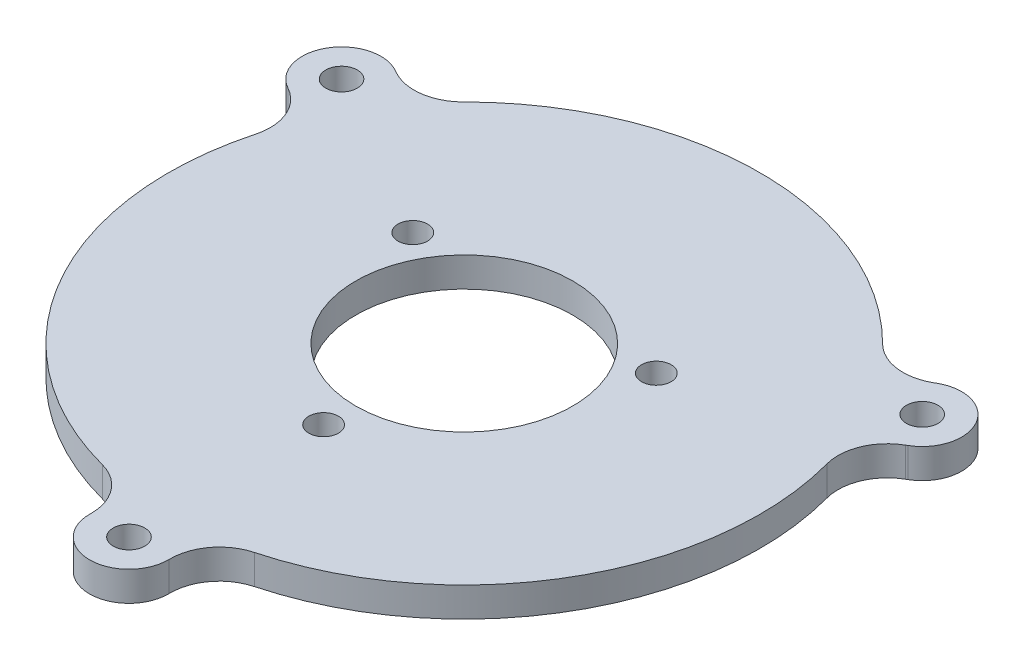
ISO-10303-21;
HEADER;
FILE_DESCRIPTION(('STEP AP214'),'2;1');
FILE_NAME('part.step','',(''),(''),'','','');
FILE_SCHEMA(('AUTOMOTIVE_DESIGN { 1 0 10303 214 1 1 1 1 }'));
ENDSEC;
DATA;
#1=APPLICATION_CONTEXT('core data for automotive mechanical design processes');
#2=APPLICATION_PROTOCOL_DEFINITION('international standard','automotive_design',2000,#1);
#3=PRODUCT_CONTEXT('',#1,'mechanical');
#4=PRODUCT('Part','Part','',(#3));
#5=PRODUCT_RELATED_PRODUCT_CATEGORY('part','',(#4));
#6=PRODUCT_DEFINITION_FORMATION('','',#4);
#7=PRODUCT_DEFINITION_CONTEXT('part definition',#1,'design');
#8=PRODUCT_DEFINITION('design','',#6,#7);
#9=PRODUCT_DEFINITION_SHAPE('','',#8);
#10=(LENGTH_UNIT() NAMED_UNIT(*) SI_UNIT(.MILLI.,.METRE.));
#11=(NAMED_UNIT(*) PLANE_ANGLE_UNIT() SI_UNIT($,.RADIAN.));
#12=(NAMED_UNIT(*) SI_UNIT($,.STERADIAN.) SOLID_ANGLE_UNIT());
#13=UNCERTAINTY_MEASURE_WITH_UNIT(LENGTH_MEASURE(1.E-05),#10,'distance_accuracy_value','');
#14=(GEOMETRIC_REPRESENTATION_CONTEXT(3) GLOBAL_UNCERTAINTY_ASSIGNED_CONTEXT((#13)) GLOBAL_UNIT_ASSIGNED_CONTEXT((#10,
#11,#12)) REPRESENTATION_CONTEXT('',''));
#15=CARTESIAN_POINT('',(0.,0.,0.));
#16=DIRECTION('',(0.,0.,1.));
#17=DIRECTION('',(1.,0.,0.));
#18=AXIS2_PLACEMENT_3D('',#15,#16,#17);
#19=CARTESIAN_POINT('',(-29.444863728671,3.,-16.9999999999999));
#20=DIRECTION('',(0.,1.,0.));
#21=DIRECTION('',(0.,0.,1.));
#22=AXIS2_PLACEMENT_3D('',#19,#20,#21);
#23=PLANE('',#22);
#24=CARTESIAN_POINT('',(12.35,3.,-7.13027582449194));
#25=DIRECTION('',(0.,1.,0.));
#26=DIRECTION('',(0.,0.,1.));
#27=AXIS2_PLACEMENT_3D('',#24,#25,#26);
#28=CIRCLE('',#27,1.5);
#29=CARTESIAN_POINT('',(12.35,3.,-5.63027582449194));
#30=VERTEX_POINT('',#29);
#31=EDGE_CURVE('E342',#30,#30,#28,.T.);
#32=ORIENTED_EDGE('',*,*,#31,.F.);
#33=EDGE_LOOP('',(#32));
#34=FACE_BOUND('',#33,.T.);
#35=CARTESIAN_POINT('',(0.,3.,0.));
#36=DIRECTION('',(0.,1.,0.));
#37=DIRECTION('',(0.,0.,1.));
#38=AXIS2_PLACEMENT_3D('',#35,#36,#37);
#39=CIRCLE('',#38,11.);
#40=CARTESIAN_POINT('',(0.,3.,11.));
#41=VERTEX_POINT('',#40);
#42=EDGE_CURVE('E354',#41,#41,#39,.T.);
#43=ORIENTED_EDGE('',*,*,#42,.F.);
#44=EDGE_LOOP('',(#43));
#45=FACE_BOUND('',#44,.T.);
#46=CARTESIAN_POINT('',(29.4448637286708,3.,-17.0000000000001));
#47=DIRECTION('',(0.,1.,0.));
#48=DIRECTION('',(0.,0.,1.));
#49=AXIS2_PLACEMENT_3D('',#46,#47,#48);
#50=CIRCLE('',#49,1.6);
#51=CARTESIAN_POINT('',(29.4448637286708,3.,-15.4000000000001));
#52=VERTEX_POINT('',#51);
#53=EDGE_CURVE('E366',#52,#52,#50,.T.);
#54=ORIENTED_EDGE('',*,*,#53,.F.);
#55=EDGE_LOOP('',(#54));
#56=FACE_BOUND('',#55,.T.);
#57=CARTESIAN_POINT('',(-29.444863728671,3.,-16.9999999999999));
#58=DIRECTION('',(0.,1.,0.));
#59=DIRECTION('',(0.,0.,1.));
#60=AXIS2_PLACEMENT_3D('',#57,#58,#59);
#61=CIRCLE('',#60,3.99999999999999);
#62=CARTESIAN_POINT('',(-27.444863728671,3.,-20.4641016151377));
#63=VERTEX_POINT('',#62);
#64=CARTESIAN_POINT('',(-31.3765556631164,3.,-13.4973486798714));
#65=VERTEX_POINT('',#64);
#66=EDGE_CURVE('E201',#63,#65,#61,.T.);
#67=ORIENTED_EDGE('',*,*,#66,.T.);
#68=CARTESIAN_POINT('',(-33.7911705811732,3.,-9.11903452971064));
#69=DIRECTION('',(0.,-1.,0.));
#70=DIRECTION('',(0.,0.,1.));
#71=AXIS2_PLACEMENT_3D('',#68,#69,#70);
#72=CIRCLE('',#71,5.);
#73=CARTESIAN_POINT('',(-28.9638604981485,3.,-7.81631531118055));
#74=VERTEX_POINT('',#73);
#75=EDGE_CURVE('E114',#65,#74,#72,.T.);
#76=ORIENTED_EDGE('',*,*,#75,.T.);
#77=CARTESIAN_POINT('',(0.,3.,0.));
#78=DIRECTION('',(0.,1.,0.));
#79=DIRECTION('',(0.,0.,1.));
#80=AXIS2_PLACEMENT_3D('',#77,#78,#79);
#81=CIRCLE('',#80,30.);
#82=CARTESIAN_POINT('',(-7.71280262560254,3.,28.9915966386554));
#83=VERTEX_POINT('',#82);
#84=EDGE_CURVE('E237',#74,#83,#81,.T.);
#85=ORIENTED_EDGE('',*,*,#84,.T.);
#86=CARTESIAN_POINT('',(-8.99826972986964,3.,33.8235294117647));
#87=DIRECTION('',(0.,-1.,0.));
#88=DIRECTION('',(0.,0.,1.));
#89=AXIS2_PLACEMENT_3D('',#86,#87,#88);
#90=CIRCLE('',#89,5.);
#91=CARTESIAN_POINT('',(-3.99923099105317,3.,33.921568627451));
#92=VERTEX_POINT('',#91);
#93=EDGE_CURVE('E256',#83,#92,#90,.T.);
#94=ORIENTED_EDGE('',*,*,#93,.T.);
#95=CARTESIAN_POINT('',(0.,3.,34.));
#96=DIRECTION('',(0.,1.,0.));
#97=DIRECTION('',(0.,0.,1.));
#98=AXIS2_PLACEMENT_3D('',#95,#96,#97);
#99=CIRCLE('',#98,4.00000000000001);
#100=CARTESIAN_POINT('',(3.99923099105319,3.,33.921568627451));
#101=VERTEX_POINT('',#100);
#102=EDGE_CURVE('E253',#92,#101,#99,.T.);
#103=ORIENTED_EDGE('',*,*,#102,.T.);
#104=CARTESIAN_POINT('',(8.99826972986964,3.,33.8235294117647));
#105=DIRECTION('',(0.,-1.,0.));
#106=DIRECTION('',(0.,0.,1.));
#107=AXIS2_PLACEMENT_3D('',#104,#105,#106);
#108=CIRCLE('',#107,5.);
#109=CARTESIAN_POINT('',(7.71280262560255,3.,28.9915966386555));
#110=VERTEX_POINT('',#109);
#111=EDGE_CURVE('E255',#101,#110,#108,.T.);
#112=ORIENTED_EDGE('',*,*,#111,.T.);
#113=CARTESIAN_POINT('',(0.,3.,0.));
#114=DIRECTION('',(0.,1.,0.));
#115=DIRECTION('',(0.,0.,1.));
#116=AXIS2_PLACEMENT_3D('',#113,#114,#115);
#117=CIRCLE('',#116,30.);
#118=CARTESIAN_POINT('',(28.9642603129316,3.,-7.81483362105255));
#119=VERTEX_POINT('',#118);
#120=EDGE_CURVE('E258',#110,#119,#117,.T.);
#121=ORIENTED_EDGE('',*,*,#120,.T.);
#122=CARTESIAN_POINT('',(33.7916370317536,3.,-9.11730589122797));
#123=DIRECTION('',(0.,-1.,0.));
#124=DIRECTION('',(0.,0.,1.));
#125=AXIS2_PLACEMENT_3D('',#122,#123,#124);
#126=CIRCLE('',#125,5.);
#127=CARTESIAN_POINT('',(31.2916370317535,3.,-13.4474329101502));
#128=VERTEX_POINT('',#127);
#129=EDGE_CURVE('E264',#119,#128,#126,.T.);
#130=ORIENTED_EDGE('',*,*,#129,.T.);
#131=DIRECTION('',(0.866025403784447,0.,-0.499999999999986));
#132=VECTOR('',#131,1.);
#133=CARTESIAN_POINT('',(31.2916370317535,3.,-13.4474329101502));
#134=LINE('',#133,#132);
#135=CARTESIAN_POINT('',(31.4448637286708,3.,-13.5358983848624));
#136=VERTEX_POINT('',#135);
#137=EDGE_CURVE('E266',#128,#136,#134,.T.);
#138=ORIENTED_EDGE('',*,*,#137,.T.);
#139=CARTESIAN_POINT('',(29.4448637286708,3.,-17.0000000000001));
#140=DIRECTION('',(0.,1.,0.));
#141=DIRECTION('',(0.,0.,1.));
#142=AXIS2_PLACEMENT_3D('',#139,#140,#141);
#143=CIRCLE('',#142,4.);
#144=CARTESIAN_POINT('',(27.4448637286708,3.,-20.4641016151379));
#145=VERTEX_POINT('',#144);
#146=EDGE_CURVE('E268',#136,#145,#143,.T.);
#147=ORIENTED_EDGE('',*,*,#146,.T.);
#148=DIRECTION('',(-0.866025403784432,0.,0.500000000000012));
#149=VECTOR('',#148,1.);
#150=CARTESIAN_POINT('',(27.4448637286708,3.,-20.4641016151379));
#151=LINE('',#150,#149);
#152=CARTESIAN_POINT('',(27.2916370317535,3.,-20.3756361404257));
#153=VERTEX_POINT('',#152);
#154=EDGE_CURVE('E270',#145,#153,#151,.T.);
#155=ORIENTED_EDGE('',*,*,#154,.T.);
#156=CARTESIAN_POINT('',(24.7916370317535,3.,-24.7057631593478));
#157=DIRECTION('',(0.,-1.,0.));
#158=DIRECTION('',(0.,0.,1.));
#159=AXIS2_PLACEMENT_3D('',#156,#157,#158);
#160=CIRCLE('',#159,4.99999999999999);
#161=CARTESIAN_POINT('',(21.2499745986459,3.,-21.1763684222981));
#162=VERTEX_POINT('',#161);
#163=EDGE_CURVE('E154',#153,#162,#160,.T.);
#164=ORIENTED_EDGE('',*,*,#163,.T.);
#165=CARTESIAN_POINT('',(0.,3.,0.));
#166=DIRECTION('',(0.,1.,0.));
#167=DIRECTION('',(0.,0.,1.));
#168=AXIS2_PLACEMENT_3D('',#165,#166,#167);
#169=CIRCLE('',#168,30.);
#170=CARTESIAN_POINT('',(-21.249974598646,3.,-21.176368422298));
#171=VERTEX_POINT('',#170);
#172=EDGE_CURVE('E148',#162,#171,#169,.T.);
#173=ORIENTED_EDGE('',*,*,#172,.T.);
#174=CARTESIAN_POINT('',(-24.7916370317537,3.,-24.7057631593476));
#175=DIRECTION('',(0.,-1.,0.));
#176=DIRECTION('',(0.,0.,1.));
#177=AXIS2_PLACEMENT_3D('',#174,#175,#176);
#178=CIRCLE('',#177,5.);
#179=CARTESIAN_POINT('',(-27.2916370317537,3.,-20.3756361404254));
#180=VERTEX_POINT('',#179);
#181=EDGE_CURVE('E152',#171,#180,#178,.T.);
#182=ORIENTED_EDGE('',*,*,#181,.T.);
#183=DIRECTION('',(-0.866025403784431,0.,-0.500000000000014));
#184=VECTOR('',#183,1.);
#185=CARTESIAN_POINT('',(-27.2916370317537,3.,-20.3756361404254));
#186=LINE('',#185,#184);
#187=EDGE_CURVE('E50',#180,#63,#186,.T.);
#188=ORIENTED_EDGE('',*,*,#187,.T.);
#189=EDGE_LOOP('',(#67,#76,#85,#94,#103,#112,#121,#130,#138,#147,#155,#164,#173,#182,#188));
#190=FACE_BOUND('',#189,.T.);
#191=CARTESIAN_POINT('',(-29.4448637286713,3.,-17.0000000000001));
#192=DIRECTION('',(0.,1.,0.));
#193=DIRECTION('',(0.,0.,1.));
#194=AXIS2_PLACEMENT_3D('',#191,#192,#193);
#195=CIRCLE('',#194,1.6);
#196=CARTESIAN_POINT('',(-29.4448637286713,3.,-15.4000000000001));
#197=VERTEX_POINT('',#196);
#198=EDGE_CURVE('E176',#197,#197,#195,.T.);
#199=ORIENTED_EDGE('',*,*,#198,.F.);
#200=EDGE_LOOP('',(#199));
#201=FACE_BOUND('',#200,.T.);
#202=CARTESIAN_POINT('',(0.,3.,34.0000000000004));
#203=DIRECTION('',(0.,1.,0.));
#204=DIRECTION('',(0.,0.,1.));
#205=AXIS2_PLACEMENT_3D('',#202,#203,#204);
#206=CIRCLE('',#205,1.6);
#207=CARTESIAN_POINT('',(0.,3.,35.6000000000004));
#208=VERTEX_POINT('',#207);
#209=EDGE_CURVE('E360',#208,#208,#206,.T.);
#210=ORIENTED_EDGE('',*,*,#209,.F.);
#211=EDGE_LOOP('',(#210));
#212=FACE_BOUND('',#211,.T.);
#213=CARTESIAN_POINT('',(-12.35,3.,-7.13027582449185));
#214=DIRECTION('',(0.,1.,0.));
#215=DIRECTION('',(0.,0.,1.));
#216=AXIS2_PLACEMENT_3D('',#213,#214,#215);
#217=CIRCLE('',#216,1.5);
#218=CARTESIAN_POINT('',(-12.35,3.,-5.63027582449185));
#219=VERTEX_POINT('',#218);
#220=EDGE_CURVE('E348',#219,#219,#217,.T.);
#221=ORIENTED_EDGE('',*,*,#220,.F.);
#222=EDGE_LOOP('',(#221));
#223=FACE_BOUND('',#222,.T.);
#224=CARTESIAN_POINT('',(0.,3.,14.2605516489838));
#225=DIRECTION('',(0.,1.,0.));
#226=DIRECTION('',(0.,0.,1.));
#227=AXIS2_PLACEMENT_3D('',#224,#225,#226);
#228=CIRCLE('',#227,1.5);
#229=CARTESIAN_POINT('',(0.,3.,15.7605516489838));
#230=VERTEX_POINT('',#229);
#231=EDGE_CURVE('E333',#230,#230,#228,.T.);
#232=ORIENTED_EDGE('',*,*,#231,.F.);
#233=EDGE_LOOP('',(#232));
#234=FACE_BOUND('',#233,.T.);
#235=ADVANCED_FACE('F33',(#34,#45,#56,#190,#201,#212,#223,#234),#23,.T.);
#236=CARTESIAN_POINT('',(-29.444863728671,0.,-16.9999999999999));
#237=DIRECTION('',(0.,1.,0.));
#238=DIRECTION('',(0.,0.,1.));
#239=AXIS2_PLACEMENT_3D('',#236,#237,#238);
#240=PLANE('',#239);
#241=CARTESIAN_POINT('',(-29.444863728671,0.,-16.9999999999999));
#242=DIRECTION('',(0.,1.,0.));
#243=DIRECTION('',(0.,0.,1.));
#244=AXIS2_PLACEMENT_3D('',#241,#242,#243);
#245=CIRCLE('',#244,3.99999999999999);
#246=CARTESIAN_POINT('',(-27.444863728671,0.,-20.4641016151377));
#247=VERTEX_POINT('',#246);
#248=CARTESIAN_POINT('',(-31.3765556631164,0.,-13.4973486798714));
#249=VERTEX_POINT('',#248);
#250=EDGE_CURVE('E172',#247,#249,#245,.T.);
#251=ORIENTED_EDGE('',*,*,#250,.F.);
#252=DIRECTION('',(-0.866025403784431,0.,-0.500000000000014));
#253=VECTOR('',#252,1.);
#254=CARTESIAN_POINT('',(-27.2916370317537,0.,-20.3756361404254));
#255=LINE('',#254,#253);
#256=CARTESIAN_POINT('',(-27.2916370317537,0.,-20.3756361404254));
#257=VERTEX_POINT('',#256);
#258=EDGE_CURVE('E106',#257,#247,#255,.T.);
#259=ORIENTED_EDGE('',*,*,#258,.F.);
#260=CARTESIAN_POINT('',(-24.7916370317537,0.,-24.7057631593476));
#261=DIRECTION('',(0.,-1.,0.));
#262=DIRECTION('',(0.,0.,1.));
#263=AXIS2_PLACEMENT_3D('',#260,#261,#262);
#264=CIRCLE('',#263,5.);
#265=CARTESIAN_POINT('',(-21.249974598646,0.,-21.176368422298));
#266=VERTEX_POINT('',#265);
#267=EDGE_CURVE('E100',#266,#257,#264,.T.);
#268=ORIENTED_EDGE('',*,*,#267,.F.);
#269=CARTESIAN_POINT('',(0.,0.,0.));
#270=DIRECTION('',(0.,1.,0.));
#271=DIRECTION('',(0.,0.,1.));
#272=AXIS2_PLACEMENT_3D('',#269,#270,#271);
#273=CIRCLE('',#272,30.);
#274=CARTESIAN_POINT('',(21.2499745986459,0.,-21.1763684222981));
#275=VERTEX_POINT('',#274);
#276=EDGE_CURVE('E162',#275,#266,#273,.T.);
#277=ORIENTED_EDGE('',*,*,#276,.F.);
#278=CARTESIAN_POINT('',(24.7916370317535,0.,-24.7057631593478));
#279=DIRECTION('',(0.,-1.,0.));
#280=DIRECTION('',(0.,0.,1.));
#281=AXIS2_PLACEMENT_3D('',#278,#279,#280);
#282=CIRCLE('',#281,4.99999999999999);
#283=CARTESIAN_POINT('',(27.2916370317535,0.,-20.3756361404257));
#284=VERTEX_POINT('',#283);
#285=EDGE_CURVE('E196',#284,#275,#282,.T.);
#286=ORIENTED_EDGE('',*,*,#285,.F.);
#287=DIRECTION('',(-0.866025403784432,0.,0.500000000000012));
#288=VECTOR('',#287,1.);
#289=CARTESIAN_POINT('',(27.4448637286708,0.,-20.4641016151379));
#290=LINE('',#289,#288);
#291=CARTESIAN_POINT('',(27.4448637286708,0.,-20.4641016151379));
#292=VERTEX_POINT('',#291);
#293=EDGE_CURVE('E194',#292,#284,#290,.T.);
#294=ORIENTED_EDGE('',*,*,#293,.F.);
#295=CARTESIAN_POINT('',(29.4448637286708,0.,-17.0000000000001));
#296=DIRECTION('',(0.,1.,0.));
#297=DIRECTION('',(0.,0.,1.));
#298=AXIS2_PLACEMENT_3D('',#295,#296,#297);
#299=CIRCLE('',#298,4.);
#300=CARTESIAN_POINT('',(31.4448637286708,0.,-13.5358983848624));
#301=VERTEX_POINT('',#300);
#302=EDGE_CURVE('E192',#301,#292,#299,.T.);
#303=ORIENTED_EDGE('',*,*,#302,.F.);
#304=DIRECTION('',(0.866025403784447,0.,-0.499999999999986));
#305=VECTOR('',#304,1.);
#306=CARTESIAN_POINT('',(31.2916370317535,0.,-13.4474329101502));
#307=LINE('',#306,#305);
#308=CARTESIAN_POINT('',(31.2916370317535,0.,-13.4474329101502));
#309=VERTEX_POINT('',#308);
#310=EDGE_CURVE('E190',#309,#301,#307,.T.);
#311=ORIENTED_EDGE('',*,*,#310,.F.);
#312=CARTESIAN_POINT('',(33.7916370317536,0.,-9.11730589122797));
#313=DIRECTION('',(0.,-1.,0.));
#314=DIRECTION('',(0.,0.,1.));
#315=AXIS2_PLACEMENT_3D('',#312,#313,#314);
#316=CIRCLE('',#315,5.);
#317=CARTESIAN_POINT('',(28.9642603129316,0.,-7.81483362105255));
#318=VERTEX_POINT('',#317);
#319=EDGE_CURVE('E188',#318,#309,#316,.T.);
#320=ORIENTED_EDGE('',*,*,#319,.F.);
#321=CARTESIAN_POINT('',(0.,0.,0.));
#322=DIRECTION('',(0.,1.,0.));
#323=DIRECTION('',(0.,0.,1.));
#324=AXIS2_PLACEMENT_3D('',#321,#322,#323);
#325=CIRCLE('',#324,30.);
#326=CARTESIAN_POINT('',(7.71280262560255,0.,28.9915966386555));
#327=VERTEX_POINT('',#326);
#328=EDGE_CURVE('E186',#327,#318,#325,.T.);
#329=ORIENTED_EDGE('',*,*,#328,.F.);
#330=CARTESIAN_POINT('',(8.99826972986964,0.,33.8235294117647));
#331=DIRECTION('',(0.,-1.,0.));
#332=DIRECTION('',(0.,0.,1.));
#333=AXIS2_PLACEMENT_3D('',#330,#331,#332);
#334=CIRCLE('',#333,5.);
#335=CARTESIAN_POINT('',(3.99923099105319,0.,33.921568627451));
#336=VERTEX_POINT('',#335);
#337=EDGE_CURVE('E184',#336,#327,#334,.T.);
#338=ORIENTED_EDGE('',*,*,#337,.F.);
#339=CARTESIAN_POINT('',(0.,0.,34.));
#340=DIRECTION('',(0.,1.,0.));
#341=DIRECTION('',(0.,0.,1.));
#342=AXIS2_PLACEMENT_3D('',#339,#340,#341);
#343=CIRCLE('',#342,4.00000000000001);
#344=CARTESIAN_POINT('',(-3.99923099105317,0.,33.921568627451));
#345=VERTEX_POINT('',#344);
#346=EDGE_CURVE('E182',#345,#336,#343,.T.);
#347=ORIENTED_EDGE('',*,*,#346,.F.);
#348=CARTESIAN_POINT('',(-8.99826972986964,0.,33.8235294117647));
#349=DIRECTION('',(0.,-1.,0.));
#350=DIRECTION('',(0.,0.,1.));
#351=AXIS2_PLACEMENT_3D('',#348,#349,#350);
#352=CIRCLE('',#351,5.);
#353=CARTESIAN_POINT('',(-7.71280262560254,0.,28.9915966386554));
#354=VERTEX_POINT('',#353);
#355=EDGE_CURVE('E180',#354,#345,#352,.T.);
#356=ORIENTED_EDGE('',*,*,#355,.F.);
#357=CARTESIAN_POINT('',(0.,0.,0.));
#358=DIRECTION('',(0.,1.,0.));
#359=DIRECTION('',(0.,0.,1.));
#360=AXIS2_PLACEMENT_3D('',#357,#358,#359);
#361=CIRCLE('',#360,30.);
#362=CARTESIAN_POINT('',(-28.9638604981485,0.,-7.81631531118055));
#363=VERTEX_POINT('',#362);
#364=EDGE_CURVE('E178',#363,#354,#361,.T.);
#365=ORIENTED_EDGE('',*,*,#364,.F.);
#366=CARTESIAN_POINT('',(-33.7911705811732,0.,-9.11903452971064));
#367=DIRECTION('',(0.,-1.,0.));
#368=DIRECTION('',(0.,0.,1.));
#369=AXIS2_PLACEMENT_3D('',#366,#367,#368);
#370=CIRCLE('',#369,5.);
#371=EDGE_CURVE('E175',#249,#363,#370,.T.);
#372=ORIENTED_EDGE('',*,*,#371,.F.);
#373=EDGE_LOOP('',(#251,#259,#268,#277,#286,#294,#303,#311,#320,#329,#338,#347,#356,#365,#372));
#374=FACE_BOUND('',#373,.T.);
#375=CARTESIAN_POINT('',(-29.4448637286713,0.,-17.0000000000001));
#376=DIRECTION('',(0.,1.,0.));
#377=DIRECTION('',(0.,0.,1.));
#378=AXIS2_PLACEMENT_3D('',#375,#376,#377);
#379=CIRCLE('',#378,1.6);
#380=CARTESIAN_POINT('',(-29.4448637286713,0.,-15.4000000000001));
#381=VERTEX_POINT('',#380);
#382=EDGE_CURVE('E369',#381,#381,#379,.T.);
#383=ORIENTED_EDGE('',*,*,#382,.T.);
#384=EDGE_LOOP('',(#383));
#385=FACE_BOUND('',#384,.T.);
#386=CARTESIAN_POINT('',(29.4448637286708,0.,-17.0000000000001));
#387=DIRECTION('',(0.,1.,0.));
#388=DIRECTION('',(0.,0.,1.));
#389=AXIS2_PLACEMENT_3D('',#386,#387,#388);
#390=CIRCLE('',#389,1.6);
#391=CARTESIAN_POINT('',(29.4448637286708,0.,-15.4000000000001));
#392=VERTEX_POINT('',#391);
#393=EDGE_CURVE('E363',#392,#392,#390,.T.);
#394=ORIENTED_EDGE('',*,*,#393,.T.);
#395=EDGE_LOOP('',(#394));
#396=FACE_BOUND('',#395,.T.);
#397=CARTESIAN_POINT('',(0.,0.,34.0000000000004));
#398=DIRECTION('',(0.,1.,0.));
#399=DIRECTION('',(0.,0.,1.));
#400=AXIS2_PLACEMENT_3D('',#397,#398,#399);
#401=CIRCLE('',#400,1.6);
#402=CARTESIAN_POINT('',(0.,0.,35.6000000000004));
#403=VERTEX_POINT('',#402);
#404=EDGE_CURVE('E357',#403,#403,#401,.T.);
#405=ORIENTED_EDGE('',*,*,#404,.T.);
#406=EDGE_LOOP('',(#405));
#407=FACE_BOUND('',#406,.T.);
#408=CARTESIAN_POINT('',(0.,0.,0.));
#409=DIRECTION('',(0.,1.,0.));
#410=DIRECTION('',(0.,0.,1.));
#411=AXIS2_PLACEMENT_3D('',#408,#409,#410);
#412=CIRCLE('',#411,11.);
#413=CARTESIAN_POINT('',(0.,0.,11.));
#414=VERTEX_POINT('',#413);
#415=EDGE_CURVE('E351',#414,#414,#412,.T.);
#416=ORIENTED_EDGE('',*,*,#415,.T.);
#417=EDGE_LOOP('',(#416));
#418=FACE_BOUND('',#417,.T.);
#419=CARTESIAN_POINT('',(-12.35,0.,-7.13027582449185));
#420=DIRECTION('',(0.,1.,0.));
#421=DIRECTION('',(0.,0.,1.));
#422=AXIS2_PLACEMENT_3D('',#419,#420,#421);
#423=CIRCLE('',#422,1.5);
#424=CARTESIAN_POINT('',(-12.35,0.,-5.63027582449185));
#425=VERTEX_POINT('',#424);
#426=EDGE_CURVE('E345',#425,#425,#423,.T.);
#427=ORIENTED_EDGE('',*,*,#426,.T.);
#428=EDGE_LOOP('',(#427));
#429=FACE_BOUND('',#428,.T.);
#430=CARTESIAN_POINT('',(12.35,0.,-7.13027582449194));
#431=DIRECTION('',(0.,1.,0.));
#432=DIRECTION('',(0.,0.,1.));
#433=AXIS2_PLACEMENT_3D('',#430,#431,#432);
#434=CIRCLE('',#433,1.5);
#435=CARTESIAN_POINT('',(12.35,0.,-5.63027582449194));
#436=VERTEX_POINT('',#435);
#437=EDGE_CURVE('E339',#436,#436,#434,.T.);
#438=ORIENTED_EDGE('',*,*,#437,.T.);
#439=EDGE_LOOP('',(#438));
#440=FACE_BOUND('',#439,.T.);
#441=CARTESIAN_POINT('',(0.,0.,14.2605516489838));
#442=DIRECTION('',(0.,1.,0.));
#443=DIRECTION('',(0.,0.,1.));
#444=AXIS2_PLACEMENT_3D('',#441,#442,#443);
#445=CIRCLE('',#444,1.5);
#446=CARTESIAN_POINT('',(0.,0.,15.7605516489838));
#447=VERTEX_POINT('',#446);
#448=EDGE_CURVE('E336',#447,#447,#445,.T.);
#449=ORIENTED_EDGE('',*,*,#448,.T.);
#450=EDGE_LOOP('',(#449));
#451=FACE_BOUND('',#450,.T.);
#452=ADVANCED_FACE('F241',(#374,#385,#396,#407,#418,#429,#440,#451),#240,.F.);
#453=CARTESIAN_POINT('',(-29.444863728671,3.,-16.9999999999999));
#454=DIRECTION('',(0.,-1.,0.));
#455=DIRECTION('',(0.,0.,-1.));
#456=AXIS2_PLACEMENT_3D('',#453,#454,#455);
#457=CYLINDRICAL_SURFACE('',#456,3.99999999999999);
#458=ORIENTED_EDGE('',*,*,#250,.T.);
#459=DIRECTION('',(0.,-1.,0.));
#460=VECTOR('',#459,1.);
#461=CARTESIAN_POINT('',(-31.3765556631164,3.,-13.4973486798714));
#462=LINE('',#461,#460);
#463=EDGE_CURVE('E11',#65,#249,#462,.T.);
#464=ORIENTED_EDGE('',*,*,#463,.F.);
#465=ORIENTED_EDGE('',*,*,#66,.F.);
#466=DIRECTION('',(0.,-1.,0.));
#467=VECTOR('',#466,1.);
#468=CARTESIAN_POINT('',(-27.444863728671,3.,-20.4641016151377));
#469=LINE('',#468,#467);
#470=EDGE_CURVE('E168',#63,#247,#469,.T.);
#471=ORIENTED_EDGE('',*,*,#470,.T.);
#472=EDGE_LOOP('',(#458,#464,#465,#471));
#473=FACE_BOUND('',#472,.T.);
#474=ADVANCED_FACE('F35',(#473),#457,.T.);
#475=CARTESIAN_POINT('',(-33.7911705811732,3.,-9.11903452971064));
#476=DIRECTION('',(0.,-1.,0.));
#477=DIRECTION('',(0.,0.,-1.));
#478=AXIS2_PLACEMENT_3D('',#475,#476,#477);
#479=CYLINDRICAL_SURFACE('',#478,5.);
#480=ORIENTED_EDGE('',*,*,#371,.T.);
#481=DIRECTION('',(0.,-1.,0.));
#482=VECTOR('',#481,1.);
#483=CARTESIAN_POINT('',(-28.9638604981485,3.,-7.81631531118055));
#484=LINE('',#483,#482);
#485=EDGE_CURVE('E42',#74,#363,#484,.T.);
#486=ORIENTED_EDGE('',*,*,#485,.F.);
#487=ORIENTED_EDGE('',*,*,#75,.F.);
#488=ORIENTED_EDGE('',*,*,#463,.T.);
#489=EDGE_LOOP('',(#480,#486,#487,#488));
#490=FACE_BOUND('',#489,.T.);
#491=ADVANCED_FACE('F536',(#490),#479,.F.);
#492=CARTESIAN_POINT('',(0.,3.,0.));
#493=DIRECTION('',(0.,-1.,0.));
#494=DIRECTION('',(0.,0.,-1.));
#495=AXIS2_PLACEMENT_3D('',#492,#493,#494);
#496=CYLINDRICAL_SURFACE('',#495,30.);
#497=ORIENTED_EDGE('',*,*,#364,.T.);
#498=DIRECTION('',(0.,-1.,0.));
#499=VECTOR('',#498,1.);
#500=CARTESIAN_POINT('',(-7.71280262560254,3.,28.9915966386554));
#501=LINE('',#500,#499);
#502=EDGE_CURVE('E229',#83,#354,#501,.T.);
#503=ORIENTED_EDGE('',*,*,#502,.F.);
#504=ORIENTED_EDGE('',*,*,#84,.F.);
#505=ORIENTED_EDGE('',*,*,#485,.T.);
#506=EDGE_LOOP('',(#497,#503,#504,#505));
#507=FACE_BOUND('',#506,.T.);
#508=ADVANCED_FACE('F235',(#507),#496,.T.);
#509=CARTESIAN_POINT('',(-8.99826972986964,3.,33.8235294117647));
#510=DIRECTION('',(0.,-1.,0.));
#511=DIRECTION('',(0.,0.,-1.));
#512=AXIS2_PLACEMENT_3D('',#509,#510,#511);
#513=CYLINDRICAL_SURFACE('',#512,5.);
#514=ORIENTED_EDGE('',*,*,#355,.T.);
#515=DIRECTION('',(0.,-1.,0.));
#516=VECTOR('',#515,1.);
#517=CARTESIAN_POINT('',(-3.99923099105317,3.,33.921568627451));
#518=LINE('',#517,#516);
#519=EDGE_CURVE('E226',#92,#345,#518,.T.);
#520=ORIENTED_EDGE('',*,*,#519,.F.);
#521=ORIENTED_EDGE('',*,*,#93,.F.);
#522=ORIENTED_EDGE('',*,*,#502,.T.);
#523=EDGE_LOOP('',(#514,#520,#521,#522));
#524=FACE_BOUND('',#523,.T.);
#525=ADVANCED_FACE('F247',(#524),#513,.F.);
#526=CARTESIAN_POINT('',(0.,3.,34.));
#527=DIRECTION('',(0.,-1.,0.));
#528=DIRECTION('',(0.,0.,-1.));
#529=AXIS2_PLACEMENT_3D('',#526,#527,#528);
#530=CYLINDRICAL_SURFACE('',#529,4.00000000000001);
#531=ORIENTED_EDGE('',*,*,#346,.T.);
#532=DIRECTION('',(0.,-1.,0.));
#533=VECTOR('',#532,1.);
#534=CARTESIAN_POINT('',(3.99923099105319,3.,33.921568627451));
#535=LINE('',#534,#533);
#536=EDGE_CURVE('E223',#101,#336,#535,.T.);
#537=ORIENTED_EDGE('',*,*,#536,.F.);
#538=ORIENTED_EDGE('',*,*,#102,.F.);
#539=ORIENTED_EDGE('',*,*,#519,.T.);
#540=EDGE_LOOP('',(#531,#537,#538,#539));
#541=FACE_BOUND('',#540,.T.);
#542=ADVANCED_FACE('F251',(#541),#530,.T.);
#543=CARTESIAN_POINT('',(8.99826972986964,3.,33.8235294117647));
#544=DIRECTION('',(0.,-1.,0.));
#545=DIRECTION('',(0.,0.,-1.));
#546=AXIS2_PLACEMENT_3D('',#543,#544,#545);
#547=CYLINDRICAL_SURFACE('',#546,5.);
#548=ORIENTED_EDGE('',*,*,#337,.T.);
#549=DIRECTION('',(0.,-1.,0.));
#550=VECTOR('',#549,1.);
#551=CARTESIAN_POINT('',(7.71280262560255,3.,28.9915966386555));
#552=LINE('',#551,#550);
#553=EDGE_CURVE('E220',#110,#327,#552,.T.);
#554=ORIENTED_EDGE('',*,*,#553,.F.);
#555=ORIENTED_EDGE('',*,*,#111,.F.);
#556=ORIENTED_EDGE('',*,*,#536,.T.);
#557=EDGE_LOOP('',(#548,#554,#555,#556));
#558=FACE_BOUND('',#557,.T.);
#559=ADVANCED_FACE('F501',(#558),#547,.F.);
#560=CARTESIAN_POINT('',(0.,3.,0.));
#561=DIRECTION('',(0.,-1.,0.));
#562=DIRECTION('',(0.,0.,-1.));
#563=AXIS2_PLACEMENT_3D('',#560,#561,#562);
#564=CYLINDRICAL_SURFACE('',#563,30.);
#565=ORIENTED_EDGE('',*,*,#328,.T.);
#566=DIRECTION('',(0.,-1.,0.));
#567=VECTOR('',#566,1.);
#568=CARTESIAN_POINT('',(28.9642603129316,3.,-7.81483362105255));
#569=LINE('',#568,#567);
#570=EDGE_CURVE('E217',#119,#318,#569,.T.);
#571=ORIENTED_EDGE('',*,*,#570,.F.);
#572=ORIENTED_EDGE('',*,*,#120,.F.);
#573=ORIENTED_EDGE('',*,*,#553,.T.);
#574=EDGE_LOOP('',(#565,#571,#572,#573));
#575=FACE_BOUND('',#574,.T.);
#576=ADVANCED_FACE('F491',(#575),#564,.T.);
#577=CARTESIAN_POINT('',(33.7916370317536,3.,-9.11730589122797));
#578=DIRECTION('',(0.,-1.,0.));
#579=DIRECTION('',(0.,0.,-1.));
#580=AXIS2_PLACEMENT_3D('',#577,#578,#579);
#581=CYLINDRICAL_SURFACE('',#580,5.);
#582=ORIENTED_EDGE('',*,*,#319,.T.);
#583=DIRECTION('',(0.,-1.,0.));
#584=VECTOR('',#583,1.);
#585=CARTESIAN_POINT('',(31.2916370317535,3.,-13.4474329101502));
#586=LINE('',#585,#584);
#587=EDGE_CURVE('E214',#128,#309,#586,.T.);
#588=ORIENTED_EDGE('',*,*,#587,.F.);
#589=ORIENTED_EDGE('',*,*,#129,.F.);
#590=ORIENTED_EDGE('',*,*,#570,.T.);
#591=EDGE_LOOP('',(#582,#588,#589,#590));
#592=FACE_BOUND('',#591,.T.);
#593=ADVANCED_FACE('F481',(#592),#581,.F.);
#594=CARTESIAN_POINT('',(31.2916370317535,3.,-13.4474329101502));
#595=DIRECTION('',(-0.499999999999986,0.,-0.866025403784447));
#596=DIRECTION('',(-0.866025403784447,0.,0.499999999999986));
#597=AXIS2_PLACEMENT_3D('',#594,#595,#596);
#598=PLANE('',#597);
#599=ORIENTED_EDGE('',*,*,#310,.T.);
#600=DIRECTION('',(0.,-1.,0.));
#601=VECTOR('',#600,1.);
#602=CARTESIAN_POINT('',(31.4448637286708,3.,-13.5358983848624));
#603=LINE('',#602,#601);
#604=EDGE_CURVE('E211',#136,#301,#603,.T.);
#605=ORIENTED_EDGE('',*,*,#604,.F.);
#606=ORIENTED_EDGE('',*,*,#137,.F.);
#607=ORIENTED_EDGE('',*,*,#587,.T.);
#608=EDGE_LOOP('',(#599,#605,#606,#607));
#609=FACE_BOUND('',#608,.T.);
#610=ADVANCED_FACE('F471',(#609),#598,.F.);
#611=CARTESIAN_POINT('',(29.4448637286708,3.,-17.0000000000001));
#612=DIRECTION('',(0.,-1.,0.));
#613=DIRECTION('',(0.,0.,-1.));
#614=AXIS2_PLACEMENT_3D('',#611,#612,#613);
#615=CYLINDRICAL_SURFACE('',#614,4.);
#616=ORIENTED_EDGE('',*,*,#302,.T.);
#617=DIRECTION('',(0.,-1.,0.));
#618=VECTOR('',#617,1.);
#619=CARTESIAN_POINT('',(27.4448637286708,3.,-20.4641016151379));
#620=LINE('',#619,#618);
#621=EDGE_CURVE('E208',#145,#292,#620,.T.);
#622=ORIENTED_EDGE('',*,*,#621,.F.);
#623=ORIENTED_EDGE('',*,*,#146,.F.);
#624=ORIENTED_EDGE('',*,*,#604,.T.);
#625=EDGE_LOOP('',(#616,#622,#623,#624));
#626=FACE_BOUND('',#625,.T.);
#627=ADVANCED_FACE('F462',(#626),#615,.T.);
#628=CARTESIAN_POINT('',(27.4448637286708,3.,-20.4641016151379));
#629=DIRECTION('',(0.500000000000011,0.,0.866025403784432));
#630=DIRECTION('',(0.866025403784432,0.,-0.500000000000012));
#631=AXIS2_PLACEMENT_3D('',#628,#629,#630);
#632=PLANE('',#631);
#633=ORIENTED_EDGE('',*,*,#293,.T.);
#634=DIRECTION('',(0.,-1.,0.));
#635=VECTOR('',#634,1.);
#636=CARTESIAN_POINT('',(27.2916370317535,3.,-20.3756361404257));
#637=LINE('',#636,#635);
#638=EDGE_CURVE('E205',#153,#284,#637,.T.);
#639=ORIENTED_EDGE('',*,*,#638,.F.);
#640=ORIENTED_EDGE('',*,*,#154,.F.);
#641=ORIENTED_EDGE('',*,*,#621,.T.);
#642=EDGE_LOOP('',(#633,#639,#640,#641));
#643=FACE_BOUND('',#642,.T.);
#644=ADVANCED_FACE('F276',(#643),#632,.F.);
#645=CARTESIAN_POINT('',(24.7916370317535,3.,-24.7057631593478));
#646=DIRECTION('',(0.,-1.,0.));
#647=DIRECTION('',(0.,0.,-1.));
#648=AXIS2_PLACEMENT_3D('',#645,#646,#647);
#649=CYLINDRICAL_SURFACE('',#648,4.99999999999999);
#650=ORIENTED_EDGE('',*,*,#285,.T.);
#651=DIRECTION('',(0.,-1.,0.));
#652=VECTOR('',#651,1.);
#653=CARTESIAN_POINT('',(21.2499745986459,3.,-21.1763684222981));
#654=LINE('',#653,#652);
#655=EDGE_CURVE('E163',#162,#275,#654,.T.);
#656=ORIENTED_EDGE('',*,*,#655,.F.);
#657=ORIENTED_EDGE('',*,*,#163,.F.);
#658=ORIENTED_EDGE('',*,*,#638,.T.);
#659=EDGE_LOOP('',(#650,#656,#657,#658));
#660=FACE_BOUND('',#659,.T.);
#661=ADVANCED_FACE('F280',(#660),#649,.F.);
#662=CARTESIAN_POINT('',(0.,3.,0.));
#663=DIRECTION('',(0.,-1.,0.));
#664=DIRECTION('',(0.,0.,-1.));
#665=AXIS2_PLACEMENT_3D('',#662,#663,#664);
#666=CYLINDRICAL_SURFACE('',#665,30.);
#667=ORIENTED_EDGE('',*,*,#276,.T.);
#668=DIRECTION('',(0.,-1.,0.));
#669=VECTOR('',#668,1.);
#670=CARTESIAN_POINT('',(-21.249974598646,3.,-21.176368422298));
#671=LINE('',#670,#669);
#672=EDGE_CURVE('E159',#171,#266,#671,.T.);
#673=ORIENTED_EDGE('',*,*,#672,.F.);
#674=ORIENTED_EDGE('',*,*,#172,.F.);
#675=ORIENTED_EDGE('',*,*,#655,.T.);
#676=EDGE_LOOP('',(#667,#673,#674,#675));
#677=FACE_BOUND('',#676,.T.);
#678=ADVANCED_FACE('F160',(#677),#666,.T.);
#679=CARTESIAN_POINT('',(-24.7916370317537,3.,-24.7057631593476));
#680=DIRECTION('',(0.,-1.,0.));
#681=DIRECTION('',(0.,0.,-1.));
#682=AXIS2_PLACEMENT_3D('',#679,#680,#681);
#683=CYLINDRICAL_SURFACE('',#682,5.);
#684=ORIENTED_EDGE('',*,*,#267,.T.);
#685=DIRECTION('',(0.,-1.,0.));
#686=VECTOR('',#685,1.);
#687=CARTESIAN_POINT('',(-27.2916370317537,3.,-20.3756361404254));
#688=LINE('',#687,#686);
#689=EDGE_CURVE('E164',#180,#257,#688,.T.);
#690=ORIENTED_EDGE('',*,*,#689,.F.);
#691=ORIENTED_EDGE('',*,*,#181,.F.);
#692=ORIENTED_EDGE('',*,*,#672,.T.);
#693=EDGE_LOOP('',(#684,#690,#691,#692));
#694=FACE_BOUND('',#693,.T.);
#695=ADVANCED_FACE('F166',(#694),#683,.F.);
#696=CARTESIAN_POINT('',(-27.2916370317537,3.,-20.3756361404254));
#697=DIRECTION('',(-0.500000000000014,0.,0.866025403784431));
#698=DIRECTION('',(0.866025403784431,0.,0.500000000000014));
#699=AXIS2_PLACEMENT_3D('',#696,#697,#698);
#700=PLANE('',#699);
#701=ORIENTED_EDGE('',*,*,#258,.T.);
#702=ORIENTED_EDGE('',*,*,#470,.F.);
#703=ORIENTED_EDGE('',*,*,#187,.F.);
#704=ORIENTED_EDGE('',*,*,#689,.T.);
#705=EDGE_LOOP('',(#701,#702,#703,#704));
#706=FACE_BOUND('',#705,.T.);
#707=ADVANCED_FACE('F284',(#706),#700,.F.);
#708=CARTESIAN_POINT('',(-29.4448637286713,3.,-17.0000000000001));
#709=DIRECTION('',(0.,-1.,0.));
#710=DIRECTION('',(0.,0.,-1.));
#711=AXIS2_PLACEMENT_3D('',#708,#709,#710);
#712=CYLINDRICAL_SURFACE('',#711,1.6);
#713=ORIENTED_EDGE('',*,*,#198,.T.);
#714=EDGE_LOOP('',(#713));
#715=FACE_BOUND('',#714,.T.);
#716=ORIENTED_EDGE('',*,*,#382,.F.);
#717=EDGE_LOOP('',(#716));
#718=FACE_BOUND('',#717,.T.);
#719=ADVANCED_FACE('F286',(#715,#718),#712,.F.);
#720=CARTESIAN_POINT('',(29.4448637286708,3.,-17.0000000000001));
#721=DIRECTION('',(0.,-1.,0.));
#722=DIRECTION('',(0.,0.,-1.));
#723=AXIS2_PLACEMENT_3D('',#720,#721,#722);
#724=CYLINDRICAL_SURFACE('',#723,1.6);
#725=ORIENTED_EDGE('',*,*,#53,.T.);
#726=EDGE_LOOP('',(#725));
#727=FACE_BOUND('',#726,.T.);
#728=ORIENTED_EDGE('',*,*,#393,.F.);
#729=EDGE_LOOP('',(#728));
#730=FACE_BOUND('',#729,.T.);
#731=ADVANCED_FACE('F292',(#727,#730),#724,.F.);
#732=CARTESIAN_POINT('',(0.,3.,34.0000000000004));
#733=DIRECTION('',(0.,-1.,0.));
#734=DIRECTION('',(0.,0.,-1.));
#735=AXIS2_PLACEMENT_3D('',#732,#733,#734);
#736=CYLINDRICAL_SURFACE('',#735,1.6);
#737=ORIENTED_EDGE('',*,*,#209,.T.);
#738=EDGE_LOOP('',(#737));
#739=FACE_BOUND('',#738,.T.);
#740=ORIENTED_EDGE('',*,*,#404,.F.);
#741=EDGE_LOOP('',(#740));
#742=FACE_BOUND('',#741,.T.);
#743=ADVANCED_FACE('F308',(#739,#742),#736,.F.);
#744=CARTESIAN_POINT('',(0.,3.,0.));
#745=DIRECTION('',(0.,-1.,0.));
#746=DIRECTION('',(0.,0.,-1.));
#747=AXIS2_PLACEMENT_3D('',#744,#745,#746);
#748=CYLINDRICAL_SURFACE('',#747,11.);
#749=ORIENTED_EDGE('',*,*,#42,.T.);
#750=EDGE_LOOP('',(#749));
#751=FACE_BOUND('',#750,.T.);
#752=ORIENTED_EDGE('',*,*,#415,.F.);
#753=EDGE_LOOP('',(#752));
#754=FACE_BOUND('',#753,.T.);
#755=ADVANCED_FACE('F312',(#751,#754),#748,.F.);
#756=CARTESIAN_POINT('',(-12.35,3.,-7.13027582449185));
#757=DIRECTION('',(0.,-1.,0.));
#758=DIRECTION('',(0.,0.,-1.));
#759=AXIS2_PLACEMENT_3D('',#756,#757,#758);
#760=CYLINDRICAL_SURFACE('',#759,1.5);
#761=ORIENTED_EDGE('',*,*,#220,.T.);
#762=EDGE_LOOP('',(#761));
#763=FACE_BOUND('',#762,.T.);
#764=ORIENTED_EDGE('',*,*,#426,.F.);
#765=EDGE_LOOP('',(#764));
#766=FACE_BOUND('',#765,.T.);
#767=ADVANCED_FACE('F316',(#763,#766),#760,.F.);
#768=CARTESIAN_POINT('',(12.35,3.,-7.13027582449194));
#769=DIRECTION('',(0.,-1.,0.));
#770=DIRECTION('',(0.,0.,-1.));
#771=AXIS2_PLACEMENT_3D('',#768,#769,#770);
#772=CYLINDRICAL_SURFACE('',#771,1.5);
#773=ORIENTED_EDGE('',*,*,#31,.T.);
#774=EDGE_LOOP('',(#773));
#775=FACE_BOUND('',#774,.T.);
#776=ORIENTED_EDGE('',*,*,#437,.F.);
#777=EDGE_LOOP('',(#776));
#778=FACE_BOUND('',#777,.T.);
#779=ADVANCED_FACE('F320',(#775,#778),#772,.F.);
#780=CARTESIAN_POINT('',(0.,3.,14.2605516489838));
#781=DIRECTION('',(0.,-1.,0.));
#782=DIRECTION('',(0.,0.,-1.));
#783=AXIS2_PLACEMENT_3D('',#780,#781,#782);
#784=CYLINDRICAL_SURFACE('',#783,1.5);
#785=ORIENTED_EDGE('',*,*,#231,.T.);
#786=EDGE_LOOP('',(#785));
#787=FACE_BOUND('',#786,.T.);
#788=ORIENTED_EDGE('',*,*,#448,.F.);
#789=EDGE_LOOP('',(#788));
#790=FACE_BOUND('',#789,.T.);
#791=ADVANCED_FACE('F324',(#787,#790),#784,.F.);
#792=CLOSED_SHELL('',(#235,#452,#474,#491,#508,#525,#542,#559,#576,#593,#610,#627,#644,#661,
#678,#695,#707,#719,#731,#743,#755,#767,#779,#791));
#793=MANIFOLD_SOLID_BREP('B2',#792);
#794=ADVANCED_BREP_SHAPE_REPRESENTATION('',(#18,#793),#14);
#795=SHAPE_DEFINITION_REPRESENTATION(#9,#794);
ENDSEC;
END-ISO-10303-21;
